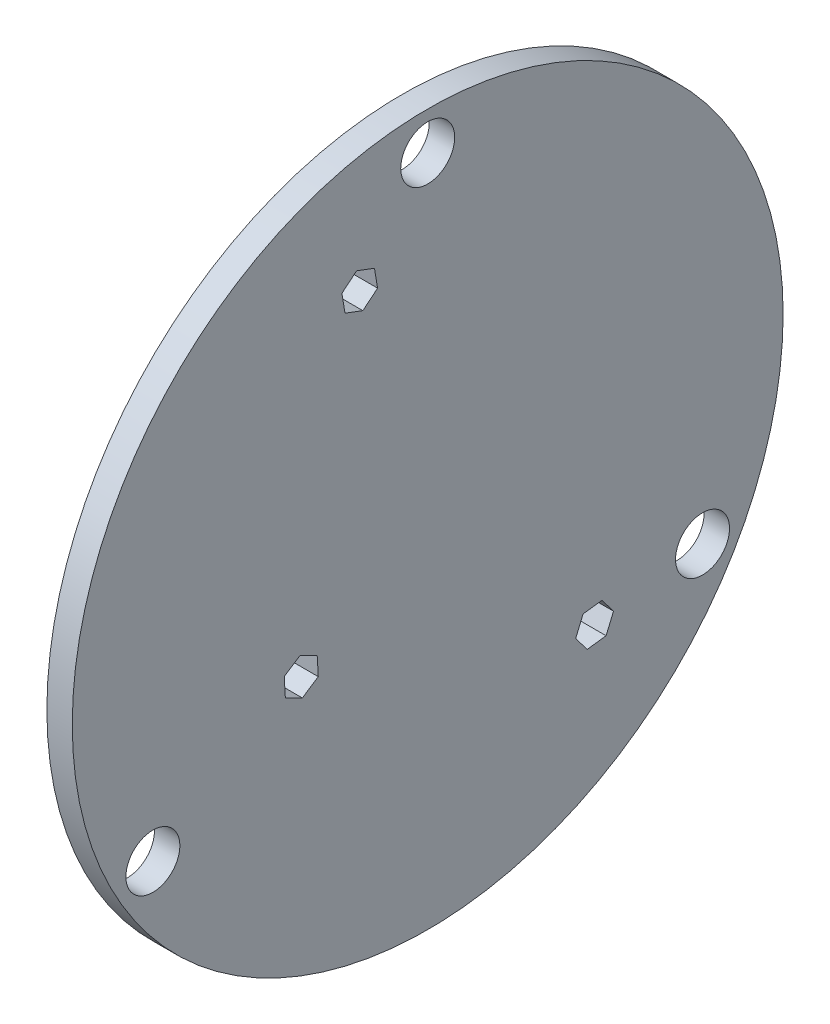
ISO-10303-21;
HEADER;
FILE_DESCRIPTION(('STEP AP214'),'2;1');
FILE_NAME('part.step','',(''),(''),'','','');
FILE_SCHEMA(('AUTOMOTIVE_DESIGN { 1 0 10303 214 1 1 1 1 }'));
ENDSEC;
DATA;
#1=APPLICATION_CONTEXT('core data for automotive mechanical design processes');
#2=APPLICATION_PROTOCOL_DEFINITION('international standard','automotive_design',2000,#1);
#3=PRODUCT_CONTEXT('',#1,'mechanical');
#4=PRODUCT('Part','Part','',(#3));
#5=PRODUCT_RELATED_PRODUCT_CATEGORY('part','',(#4));
#6=PRODUCT_DEFINITION_FORMATION('','',#4);
#7=PRODUCT_DEFINITION_CONTEXT('part definition',#1,'design');
#8=PRODUCT_DEFINITION('design','',#6,#7);
#9=PRODUCT_DEFINITION_SHAPE('','',#8);
#10=(LENGTH_UNIT() NAMED_UNIT(*) SI_UNIT(.MILLI.,.METRE.));
#11=(NAMED_UNIT(*) PLANE_ANGLE_UNIT() SI_UNIT($,.RADIAN.));
#12=(NAMED_UNIT(*) SI_UNIT($,.STERADIAN.) SOLID_ANGLE_UNIT());
#13=UNCERTAINTY_MEASURE_WITH_UNIT(LENGTH_MEASURE(1.E-05),#10,'distance_accuracy_value','');
#14=(GEOMETRIC_REPRESENTATION_CONTEXT(3) GLOBAL_UNCERTAINTY_ASSIGNED_CONTEXT((#13)) GLOBAL_UNIT_ASSIGNED_CONTEXT((#10,
#11,#12)) REPRESENTATION_CONTEXT('',''));
#15=CARTESIAN_POINT('',(0.,0.,0.));
#16=DIRECTION('',(0.,0.,1.));
#17=DIRECTION('',(1.,0.,0.));
#18=AXIS2_PLACEMENT_3D('',#15,#16,#17);
#19=CARTESIAN_POINT('',(4.,0.,0.));
#20=DIRECTION('',(-1.,0.,0.));
#21=DIRECTION('',(0.,0.,1.));
#22=AXIS2_PLACEMENT_3D('',#19,#20,#21);
#23=CYLINDRICAL_SURFACE('',#22,56.);
#24=CARTESIAN_POINT('',(4.,0.,0.));
#25=DIRECTION('',(1.,0.,0.));
#26=DIRECTION('',(0.,0.,-1.));
#27=AXIS2_PLACEMENT_3D('',#24,#25,#26);
#28=CIRCLE('',#27,56.);
#29=CARTESIAN_POINT('',(4.,0.,-56.));
#30=VERTEX_POINT('',#29);
#31=EDGE_CURVE('E11',#30,#30,#28,.T.);
#32=ORIENTED_EDGE('',*,*,#31,.F.);
#33=EDGE_LOOP('',(#32));
#34=FACE_BOUND('',#33,.T.);
#35=CARTESIAN_POINT('',(0.,0.,0.));
#36=DIRECTION('',(1.,0.,0.));
#37=DIRECTION('',(0.,0.,-1.));
#38=AXIS2_PLACEMENT_3D('',#35,#36,#37);
#39=CIRCLE('',#38,56.);
#40=CARTESIAN_POINT('',(0.,0.,-56.));
#41=VERTEX_POINT('',#40);
#42=EDGE_CURVE('E37',#41,#41,#39,.T.);
#43=ORIENTED_EDGE('',*,*,#42,.T.);
#44=EDGE_LOOP('',(#43));
#45=FACE_BOUND('',#44,.T.);
#46=ADVANCED_FACE('F34',(#34,#45),#23,.T.);
#47=CARTESIAN_POINT('',(4.,0.,0.));
#48=DIRECTION('',(1.,0.,0.));
#49=DIRECTION('',(0.,0.,-1.));
#50=AXIS2_PLACEMENT_3D('',#47,#48,#49);
#51=PLANE('',#50);
#52=DIRECTION('',(0.,-0.986414259171736,-0.164276928698694));
#53=VECTOR('',#52,1.);
#54=CARTESIAN_POINT('',(4.,37.596536924378,13.5170462951994));
#55=LINE('',#54,#53);
#56=CARTESIAN_POINT('',(4.,37.596536924378,13.5170462951994));
#57=VERTEX_POINT('',#56);
#58=CARTESIAN_POINT('',(4.,34.6351029264386,13.023850584369));
#59=VERTEX_POINT('',#58);
#60=EDGE_CURVE('E48',#57,#59,#55,.T.);
#61=ORIENTED_EDGE('',*,*,#60,.F.);
#62=DIRECTION('',(0.,-0.635475123094622,0.772121342748583));
#63=VECTOR('',#62,1.);
#64=CARTESIAN_POINT('',(4.,39.5043739379644,11.198967076768));
#65=LINE('',#64,#63);
#66=CARTESIAN_POINT('',(4.,39.5043739379644,11.198967076768));
#67=VERTEX_POINT('',#66);
#68=EDGE_CURVE('E180',#67,#57,#65,.T.);
#69=ORIENTED_EDGE('',*,*,#68,.F.);
#70=DIRECTION('',(0.,0.350939136077114,0.936398271447277));
#71=VECTOR('',#70,1.);
#72=CARTESIAN_POINT('',(4.,38.4507769536113,8.38769214750636));
#73=LINE('',#72,#71);
#74=CARTESIAN_POINT('',(4.,38.4507769536113,8.38769214750636));
#75=VERTEX_POINT('',#74);
#76=EDGE_CURVE('E183',#75,#67,#73,.T.);
#77=ORIENTED_EDGE('',*,*,#76,.F.);
#78=DIRECTION('',(0.,0.986414259171736,0.164276928698694));
#79=VECTOR('',#78,1.);
#80=CARTESIAN_POINT('',(4.,35.4893429556718,7.89449643667601));
#81=LINE('',#80,#79);
#82=CARTESIAN_POINT('',(4.,35.4893429556718,7.89449643667601));
#83=VERTEX_POINT('',#82);
#84=EDGE_CURVE('E200',#83,#75,#81,.T.);
#85=ORIENTED_EDGE('',*,*,#84,.F.);
#86=DIRECTION('',(0.,0.635475123094621,-0.772121342748584));
#87=VECTOR('',#86,1.);
#88=CARTESIAN_POINT('',(4.,33.5815059420854,10.2125756551073));
#89=LINE('',#88,#87);
#90=CARTESIAN_POINT('',(4.,33.5815059420854,10.2125756551073));
#91=VERTEX_POINT('',#90);
#92=EDGE_CURVE('E197',#91,#83,#89,.T.);
#93=ORIENTED_EDGE('',*,*,#92,.F.);
#94=DIRECTION('',(0.,-0.350939136077111,-0.936398271447278));
#95=VECTOR('',#94,1.);
#96=CARTESIAN_POINT('',(4.,34.6351029264386,13.023850584369));
#97=LINE('',#96,#95);
#98=EDGE_CURVE('E194',#59,#91,#97,.T.);
#99=ORIENTED_EDGE('',*,*,#98,.F.);
#100=EDGE_LOOP('',(#61,#69,#77,#85,#93,#99));
#101=FACE_BOUND('',#100,.T.);
#102=DIRECTION('',(0.,0.548968693626043,-0.835842911926946));
#103=VECTOR('',#102,1.);
#104=CARTESIAN_POINT('',(4.,-14.4972543509171,19.7459584221384));
#105=LINE('',#104,#103);
#106=CARTESIAN_POINT('',(4.,-14.4972543509171,19.7459584221384));
#107=VERTEX_POINT('',#106);
#108=CARTESIAN_POINT('',(4.,-12.8491287911004,17.2365729450918));
#109=VERTEX_POINT('',#108);
#110=EDGE_CURVE('E56',#107,#109,#105,.T.);
#111=ORIENTED_EDGE('',*,*,#110,.F.);
#112=DIRECTION('',(0.,-0.449376848488872,-0.893342290525983));
#113=VECTOR('',#112,1.);
#114=CARTESIAN_POINT('',(4.,-13.1481255598154,22.4279697640894));
#115=LINE('',#114,#113);
#116=CARTESIAN_POINT('',(4.,-13.1481255598154,22.4279697640894));
#117=VERTEX_POINT('',#116);
#118=EDGE_CURVE('E219',#117,#107,#115,.T.);
#119=ORIENTED_EDGE('',*,*,#118,.F.);
#120=DIRECTION('',(0.,-0.998345542114916,-0.0574993785990369));
#121=VECTOR('',#120,1.);
#122=CARTESIAN_POINT('',(4.,-10.150871208897,22.6005956289938));
#123=LINE('',#122,#121);
#124=CARTESIAN_POINT('',(4.,-10.150871208897,22.6005956289938));
#125=VERTEX_POINT('',#124);
#126=EDGE_CURVE('E245',#125,#117,#123,.T.);
#127=ORIENTED_EDGE('',*,*,#126,.F.);
#128=DIRECTION('',(0.,-0.548968693626043,0.835842911926945));
#129=VECTOR('',#128,1.);
#130=CARTESIAN_POINT('',(4.,-8.50274564908032,20.0912101519473));
#131=LINE('',#130,#129);
#132=CARTESIAN_POINT('',(4.,-8.50274564908032,20.0912101519473));
#133=VERTEX_POINT('',#132);
#134=EDGE_CURVE('E242',#133,#125,#131,.T.);
#135=ORIENTED_EDGE('',*,*,#134,.F.);
#136=DIRECTION('',(0.,0.449376848488873,0.893342290525982));
#137=VECTOR('',#136,1.);
#138=CARTESIAN_POINT('',(4.,-9.85187444018203,17.4091988099963));
#139=LINE('',#138,#137);
#140=CARTESIAN_POINT('',(4.,-9.85187444018203,17.4091988099963));
#141=VERTEX_POINT('',#140);
#142=EDGE_CURVE('E239',#141,#133,#139,.T.);
#143=ORIENTED_EDGE('',*,*,#142,.F.);
#144=DIRECTION('',(0.,0.998345542114916,0.0574993785990368));
#145=VECTOR('',#144,1.);
#146=CARTESIAN_POINT('',(4.,-12.8491287911004,17.2365729450918));
#147=LINE('',#146,#145);
#148=EDGE_CURVE('E236',#109,#141,#147,.T.);
#149=ORIENTED_EDGE('',*,*,#148,.F.);
#150=EDGE_LOOP('',(#111,#119,#127,#135,#143,#149));
#151=FACE_BOUND('',#150,.T.);
#152=DIRECTION('',(0.,0.796914909803171,0.60409157131465));
#153=VECTOR('',#152,1.);
#154=CARTESIAN_POINT('',(4.,-27.1685593526177,-29.2730157209621));
#155=LINE('',#154,#153);
#156=CARTESIAN_POINT('',(4.,-27.1685593526177,-29.2730157209621));
#157=VERTEX_POINT('',#156);
#158=CARTESIAN_POINT('',(4.,-24.776044356598,-27.4593990781309));
#159=VERTEX_POINT('',#158);
#160=EDGE_CURVE('E207',#157,#159,#155,.T.);
#161=ORIENTED_EDGE('',*,*,#160,.F.);
#162=DIRECTION('',(0.,0.921616101872132,-0.388102770886806));
#163=VECTOR('',#162,1.);
#164=CARTESIAN_POINT('',(4.,-29.9354549360456,-28.1078452768895));
#165=LINE('',#164,#163);
#166=CARTESIAN_POINT('',(4.,-29.9354549360456,-28.1078452768895));
#167=VERTEX_POINT('',#166);
#168=EDGE_CURVE('E264',#167,#157,#165,.T.);
#169=ORIENTED_EDGE('',*,*,#168,.F.);
#170=DIRECTION('',(0.,0.124701192068962,-0.992194342201456));
#171=VECTOR('',#170,1.);
#172=CARTESIAN_POINT('',(4.,-30.3098355234538,-25.1290581899856));
#173=LINE('',#172,#171);
#174=CARTESIAN_POINT('',(4.,-30.3098355234538,-25.1290581899856));
#175=VERTEX_POINT('',#174);
#176=EDGE_CURVE('E290',#175,#167,#173,.T.);
#177=ORIENTED_EDGE('',*,*,#176,.F.);
#178=DIRECTION('',(0.,-0.796914909803172,-0.60409157131465));
#179=VECTOR('',#178,1.);
#180=CARTESIAN_POINT('',(4.,-27.9173205274342,-23.3154415471544));
#181=LINE('',#180,#179);
#182=CARTESIAN_POINT('',(4.,-27.9173205274342,-23.3154415471544));
#183=VERTEX_POINT('',#182);
#184=EDGE_CURVE('E287',#183,#175,#181,.T.);
#185=ORIENTED_EDGE('',*,*,#184,.F.);
#186=DIRECTION('',(0.,-0.921616101872132,0.388102770886804));
#187=VECTOR('',#186,1.);
#188=CARTESIAN_POINT('',(4.,-25.1504249440063,-24.480611991227));
#189=LINE('',#188,#187);
#190=CARTESIAN_POINT('',(4.,-25.1504249440063,-24.480611991227));
#191=VERTEX_POINT('',#190);
#192=EDGE_CURVE('E284',#191,#183,#189,.T.);
#193=ORIENTED_EDGE('',*,*,#192,.F.);
#194=DIRECTION('',(0.,-0.124701192068961,0.992194342201456));
#195=VECTOR('',#194,1.);
#196=CARTESIAN_POINT('',(4.,-24.776044356598,-27.4593990781309));
#197=LINE('',#196,#195);
#198=EDGE_CURVE('E281',#159,#191,#197,.T.);
#199=ORIENTED_EDGE('',*,*,#198,.F.);
#200=EDGE_LOOP('',(#161,#169,#177,#185,#193,#199));
#201=FACE_BOUND('',#200,.T.);
#202=CARTESIAN_POINT('',(4.,-24.9999999999981,43.3012701892251));
#203=DIRECTION('',(-1.,0.,0.));
#204=DIRECTION('',(0.,0.,1.));
#205=AXIS2_PLACEMENT_3D('',#202,#203,#204);
#206=CIRCLE('',#205,4.25000000000278);
#207=CARTESIAN_POINT('',(4.,-24.9999999999981,47.5512701892279));
#208=VERTEX_POINT('',#207);
#209=EDGE_CURVE('E308',#208,#208,#206,.T.);
#210=ORIENTED_EDGE('',*,*,#209,.T.);
#211=EDGE_LOOP('',(#210));
#212=FACE_BOUND('',#211,.T.);
#213=CARTESIAN_POINT('',(4.,-25.0000000000019,-43.3012701892187));
#214=DIRECTION('',(-1.,0.,0.));
#215=DIRECTION('',(0.,0.,1.));
#216=AXIS2_PLACEMENT_3D('',#213,#214,#215);
#217=CIRCLE('',#216,4.25000000000406);
#218=CARTESIAN_POINT('',(4.,-25.0000000000019,-39.0512701892147));
#219=VERTEX_POINT('',#218);
#220=EDGE_CURVE('E315',#219,#219,#217,.T.);
#221=ORIENTED_EDGE('',*,*,#220,.T.);
#222=EDGE_LOOP('',(#221));
#223=FACE_BOUND('',#222,.T.);
#224=CARTESIAN_POINT('',(4.,50.,0.));
#225=DIRECTION('',(-1.,0.,0.));
#226=DIRECTION('',(0.,0.,1.));
#227=AXIS2_PLACEMENT_3D('',#224,#225,#226);
#228=CIRCLE('',#227,4.25);
#229=CARTESIAN_POINT('',(4.,50.,4.25));
#230=VERTEX_POINT('',#229);
#231=EDGE_CURVE('E320',#230,#230,#228,.T.);
#232=ORIENTED_EDGE('',*,*,#231,.T.);
#233=EDGE_LOOP('',(#232));
#234=FACE_BOUND('',#233,.T.);
#235=ORIENTED_EDGE('',*,*,#31,.T.);
#236=EDGE_LOOP('',(#235));
#237=FACE_BOUND('',#236,.T.);
#238=ADVANCED_FACE('F330',(#101,#151,#201,#212,#223,#234,#237),#51,.T.);
#239=CARTESIAN_POINT('',(0.,0.,0.));
#240=DIRECTION('',(1.,0.,0.));
#241=DIRECTION('',(0.,0.,-1.));
#242=AXIS2_PLACEMENT_3D('',#239,#240,#241);
#243=PLANE('',#242);
#244=DIRECTION('',(0.,-0.635475123094622,0.772121342748583));
#245=VECTOR('',#244,1.);
#246=CARTESIAN_POINT('',(0.,39.5043739379644,11.198967076768));
#247=LINE('',#246,#245);
#248=CARTESIAN_POINT('',(0.,39.5043739379644,11.198967076768));
#249=VERTEX_POINT('',#248);
#250=CARTESIAN_POINT('',(0.,37.596536924378,13.5170462951994));
#251=VERTEX_POINT('',#250);
#252=EDGE_CURVE('E166',#249,#251,#247,.T.);
#253=ORIENTED_EDGE('',*,*,#252,.T.);
#254=DIRECTION('',(0.,-0.986414259171736,-0.164276928698694));
#255=VECTOR('',#254,1.);
#256=CARTESIAN_POINT('',(0.,37.596536924378,13.5170462951994));
#257=LINE('',#256,#255);
#258=CARTESIAN_POINT('',(0.,34.6351029264386,13.023850584369));
#259=VERTEX_POINT('',#258);
#260=EDGE_CURVE('E160',#251,#259,#257,.T.);
#261=ORIENTED_EDGE('',*,*,#260,.T.);
#262=DIRECTION('',(0.,-0.350939136077111,-0.936398271447278));
#263=VECTOR('',#262,1.);
#264=CARTESIAN_POINT('',(0.,34.6351029264386,13.023850584369));
#265=LINE('',#264,#263);
#266=CARTESIAN_POINT('',(0.,33.5815059420854,10.2125756551073));
#267=VERTEX_POINT('',#266);
#268=EDGE_CURVE('E170',#259,#267,#265,.T.);
#269=ORIENTED_EDGE('',*,*,#268,.T.);
#270=DIRECTION('',(0.,0.635475123094621,-0.772121342748584));
#271=VECTOR('',#270,1.);
#272=CARTESIAN_POINT('',(0.,33.5815059420854,10.2125756551073));
#273=LINE('',#272,#271);
#274=CARTESIAN_POINT('',(0.,35.4893429556718,7.89449643667601));
#275=VERTEX_POINT('',#274);
#276=EDGE_CURVE('E174',#267,#275,#273,.T.);
#277=ORIENTED_EDGE('',*,*,#276,.T.);
#278=DIRECTION('',(0.,0.986414259171736,0.164276928698694));
#279=VECTOR('',#278,1.);
#280=CARTESIAN_POINT('',(0.,35.4893429556718,7.89449643667601));
#281=LINE('',#280,#279);
#282=CARTESIAN_POINT('',(0.,38.4507769536113,8.38769214750636));
#283=VERTEX_POINT('',#282);
#284=EDGE_CURVE('E187',#275,#283,#281,.T.);
#285=ORIENTED_EDGE('',*,*,#284,.T.);
#286=DIRECTION('',(0.,0.350939136077114,0.936398271447277));
#287=VECTOR('',#286,1.);
#288=CARTESIAN_POINT('',(0.,38.4507769536113,8.38769214750636));
#289=LINE('',#288,#287);
#290=EDGE_CURVE('E190',#283,#249,#289,.T.);
#291=ORIENTED_EDGE('',*,*,#290,.T.);
#292=EDGE_LOOP('',(#253,#261,#269,#277,#285,#291));
#293=FACE_BOUND('',#292,.T.);
#294=DIRECTION('',(0.,-0.449376848488872,-0.893342290525983));
#295=VECTOR('',#294,1.);
#296=CARTESIAN_POINT('',(0.,-13.1481255598154,22.4279697640894));
#297=LINE('',#296,#295);
#298=CARTESIAN_POINT('',(0.,-13.1481255598154,22.4279697640894));
#299=VERTEX_POINT('',#298);
#300=CARTESIAN_POINT('',(0.,-14.4972543509171,19.7459584221384));
#301=VERTEX_POINT('',#300);
#302=EDGE_CURVE('E231',#299,#301,#297,.T.);
#303=ORIENTED_EDGE('',*,*,#302,.T.);
#304=DIRECTION('',(0.,0.548968693626043,-0.835842911926946));
#305=VECTOR('',#304,1.);
#306=CARTESIAN_POINT('',(0.,-14.4972543509171,19.7459584221384));
#307=LINE('',#306,#305);
#308=CARTESIAN_POINT('',(0.,-12.8491287911004,17.2365729450918));
#309=VERTEX_POINT('',#308);
#310=EDGE_CURVE('E215',#301,#309,#307,.T.);
#311=ORIENTED_EDGE('',*,*,#310,.T.);
#312=DIRECTION('',(0.,0.998345542114916,0.0574993785990368));
#313=VECTOR('',#312,1.);
#314=CARTESIAN_POINT('',(0.,-12.8491287911004,17.2365729450918));
#315=LINE('',#314,#313);
#316=CARTESIAN_POINT('',(0.,-9.85187444018203,17.4091988099963));
#317=VERTEX_POINT('',#316);
#318=EDGE_CURVE('E218',#309,#317,#315,.T.);
#319=ORIENTED_EDGE('',*,*,#318,.T.);
#320=DIRECTION('',(0.,0.449376848488873,0.893342290525982));
#321=VECTOR('',#320,1.);
#322=CARTESIAN_POINT('',(0.,-9.85187444018203,17.4091988099963));
#323=LINE('',#322,#321);
#324=CARTESIAN_POINT('',(0.,-8.50274564908032,20.0912101519473));
#325=VERTEX_POINT('',#324);
#326=EDGE_CURVE('E222',#317,#325,#323,.T.);
#327=ORIENTED_EDGE('',*,*,#326,.T.);
#328=DIRECTION('',(0.,-0.548968693626043,0.835842911926945));
#329=VECTOR('',#328,1.);
#330=CARTESIAN_POINT('',(0.,-8.50274564908032,20.0912101519473));
#331=LINE('',#330,#329);
#332=CARTESIAN_POINT('',(0.,-10.150871208897,22.6005956289938));
#333=VERTEX_POINT('',#332);
#334=EDGE_CURVE('E225',#325,#333,#331,.T.);
#335=ORIENTED_EDGE('',*,*,#334,.T.);
#336=DIRECTION('',(0.,-0.998345542114916,-0.0574993785990369));
#337=VECTOR('',#336,1.);
#338=CARTESIAN_POINT('',(0.,-10.150871208897,22.6005956289938));
#339=LINE('',#338,#337);
#340=EDGE_CURVE('E228',#333,#299,#339,.T.);
#341=ORIENTED_EDGE('',*,*,#340,.T.);
#342=EDGE_LOOP('',(#303,#311,#319,#327,#335,#341));
#343=FACE_BOUND('',#342,.T.);
#344=DIRECTION('',(0.,0.921616101872132,-0.388102770886806));
#345=VECTOR('',#344,1.);
#346=CARTESIAN_POINT('',(0.,-29.9354549360456,-28.1078452768895));
#347=LINE('',#346,#345);
#348=CARTESIAN_POINT('',(0.,-29.9354549360456,-28.1078452768895));
#349=VERTEX_POINT('',#348);
#350=CARTESIAN_POINT('',(0.,-27.1685593526177,-29.2730157209621));
#351=VERTEX_POINT('',#350);
#352=EDGE_CURVE('E276',#349,#351,#347,.T.);
#353=ORIENTED_EDGE('',*,*,#352,.T.);
#354=DIRECTION('',(0.,0.796914909803171,0.60409157131465));
#355=VECTOR('',#354,1.);
#356=CARTESIAN_POINT('',(0.,-27.1685593526177,-29.2730157209621));
#357=LINE('',#356,#355);
#358=CARTESIAN_POINT('',(0.,-24.776044356598,-27.4593990781309));
#359=VERTEX_POINT('',#358);
#360=EDGE_CURVE('E260',#351,#359,#357,.T.);
#361=ORIENTED_EDGE('',*,*,#360,.T.);
#362=DIRECTION('',(0.,-0.124701192068961,0.992194342201456));
#363=VECTOR('',#362,1.);
#364=CARTESIAN_POINT('',(0.,-24.776044356598,-27.4593990781309));
#365=LINE('',#364,#363);
#366=CARTESIAN_POINT('',(0.,-25.1504249440063,-24.480611991227));
#367=VERTEX_POINT('',#366);
#368=EDGE_CURVE('E263',#359,#367,#365,.T.);
#369=ORIENTED_EDGE('',*,*,#368,.T.);
#370=DIRECTION('',(0.,-0.921616101872132,0.388102770886804));
#371=VECTOR('',#370,1.);
#372=CARTESIAN_POINT('',(0.,-25.1504249440063,-24.480611991227));
#373=LINE('',#372,#371);
#374=CARTESIAN_POINT('',(0.,-27.9173205274342,-23.3154415471544));
#375=VERTEX_POINT('',#374);
#376=EDGE_CURVE('E267',#367,#375,#373,.T.);
#377=ORIENTED_EDGE('',*,*,#376,.T.);
#378=DIRECTION('',(0.,-0.796914909803172,-0.60409157131465));
#379=VECTOR('',#378,1.);
#380=CARTESIAN_POINT('',(0.,-27.9173205274342,-23.3154415471544));
#381=LINE('',#380,#379);
#382=CARTESIAN_POINT('',(0.,-30.3098355234538,-25.1290581899856));
#383=VERTEX_POINT('',#382);
#384=EDGE_CURVE('E270',#375,#383,#381,.T.);
#385=ORIENTED_EDGE('',*,*,#384,.T.);
#386=DIRECTION('',(0.,0.124701192068962,-0.992194342201456));
#387=VECTOR('',#386,1.);
#388=CARTESIAN_POINT('',(0.,-30.3098355234538,-25.1290581899856));
#389=LINE('',#388,#387);
#390=EDGE_CURVE('E273',#383,#349,#389,.T.);
#391=ORIENTED_EDGE('',*,*,#390,.T.);
#392=EDGE_LOOP('',(#353,#361,#369,#377,#385,#391));
#393=FACE_BOUND('',#392,.T.);
#394=CARTESIAN_POINT('',(0.,-24.9999999999981,43.3012701892251));
#395=DIRECTION('',(-1.,0.,0.));
#396=DIRECTION('',(0.,0.,1.));
#397=AXIS2_PLACEMENT_3D('',#394,#395,#396);
#398=CIRCLE('',#397,4.25000000000278);
#399=CARTESIAN_POINT('',(0.,-24.9999999999981,47.5512701892279));
#400=VERTEX_POINT('',#399);
#401=EDGE_CURVE('E312',#400,#400,#398,.T.);
#402=ORIENTED_EDGE('',*,*,#401,.F.);
#403=EDGE_LOOP('',(#402));
#404=FACE_BOUND('',#403,.T.);
#405=CARTESIAN_POINT('',(0.,-25.0000000000019,-43.3012701892187));
#406=DIRECTION('',(-1.,0.,0.));
#407=DIRECTION('',(0.,0.,1.));
#408=AXIS2_PLACEMENT_3D('',#405,#406,#407);
#409=CIRCLE('',#408,4.25000000000406);
#410=CARTESIAN_POINT('',(0.,-25.0000000000019,-39.0512701892147));
#411=VERTEX_POINT('',#410);
#412=EDGE_CURVE('E297',#411,#411,#409,.T.);
#413=ORIENTED_EDGE('',*,*,#412,.F.);
#414=EDGE_LOOP('',(#413));
#415=FACE_BOUND('',#414,.T.);
#416=CARTESIAN_POINT('',(0.,50.,0.));
#417=DIRECTION('',(-1.,0.,0.));
#418=DIRECTION('',(0.,0.,1.));
#419=AXIS2_PLACEMENT_3D('',#416,#417,#418);
#420=CIRCLE('',#419,4.25);
#421=CARTESIAN_POINT('',(0.,50.,4.25));
#422=VERTEX_POINT('',#421);
#423=EDGE_CURVE('E311',#422,#422,#420,.T.);
#424=ORIENTED_EDGE('',*,*,#423,.F.);
#425=EDGE_LOOP('',(#424));
#426=FACE_BOUND('',#425,.T.);
#427=ORIENTED_EDGE('',*,*,#42,.F.);
#428=EDGE_LOOP('',(#427));
#429=FACE_BOUND('',#428,.T.);
#430=ADVANCED_FACE('F176',(#293,#343,#393,#404,#415,#426,#429),#243,.F.);
#431=CARTESIAN_POINT('',(4.,50.,0.));
#432=DIRECTION('',(-1.,0.,0.));
#433=DIRECTION('',(0.,0.,1.));
#434=AXIS2_PLACEMENT_3D('',#431,#432,#433);
#435=CYLINDRICAL_SURFACE('',#434,4.25);
#436=ORIENTED_EDGE('',*,*,#231,.F.);
#437=EDGE_LOOP('',(#436));
#438=FACE_BOUND('',#437,.T.);
#439=ORIENTED_EDGE('',*,*,#423,.T.);
#440=EDGE_LOOP('',(#439));
#441=FACE_BOUND('',#440,.T.);
#442=ADVANCED_FACE('F326',(#438,#441),#435,.F.);
#443=CARTESIAN_POINT('',(4.,-25.0000000000019,-43.3012701892187));
#444=DIRECTION('',(-1.,0.,0.));
#445=DIRECTION('',(0.,0.,1.));
#446=AXIS2_PLACEMENT_3D('',#443,#444,#445);
#447=CYLINDRICAL_SURFACE('',#446,4.25000000000406);
#448=ORIENTED_EDGE('',*,*,#220,.F.);
#449=EDGE_LOOP('',(#448));
#450=FACE_BOUND('',#449,.T.);
#451=ORIENTED_EDGE('',*,*,#412,.T.);
#452=EDGE_LOOP('',(#451));
#453=FACE_BOUND('',#452,.T.);
#454=ADVANCED_FACE('F349',(#450,#453),#447,.F.);
#455=CARTESIAN_POINT('',(4.,-24.9999999999981,43.3012701892251));
#456=DIRECTION('',(-1.,0.,0.));
#457=DIRECTION('',(0.,0.,1.));
#458=AXIS2_PLACEMENT_3D('',#455,#456,#457);
#459=CYLINDRICAL_SURFACE('',#458,4.25000000000278);
#460=ORIENTED_EDGE('',*,*,#209,.F.);
#461=EDGE_LOOP('',(#460));
#462=FACE_BOUND('',#461,.T.);
#463=ORIENTED_EDGE('',*,*,#401,.T.);
#464=EDGE_LOOP('',(#463));
#465=FACE_BOUND('',#464,.T.);
#466=ADVANCED_FACE('F353',(#462,#465),#459,.F.);
#467=CARTESIAN_POINT('',(0.,-27.1685593526177,-29.2730157209621));
#468=DIRECTION('',(0.,0.60409157131465,-0.796914909803171));
#469=DIRECTION('',(0.,0.796914909803171,0.60409157131465));
#470=AXIS2_PLACEMENT_3D('',#467,#468,#469);
#471=PLANE('',#470);
#472=ORIENTED_EDGE('',*,*,#160,.T.);
#473=DIRECTION('',(1.,0.,0.));
#474=VECTOR('',#473,1.);
#475=CARTESIAN_POINT('',(0.,-24.776044356598,-27.4593990781309));
#476=LINE('',#475,#474);
#477=EDGE_CURVE('E279',#359,#159,#476,.T.);
#478=ORIENTED_EDGE('',*,*,#477,.F.);
#479=ORIENTED_EDGE('',*,*,#360,.F.);
#480=DIRECTION('',(1.,0.,0.));
#481=VECTOR('',#480,1.);
#482=CARTESIAN_POINT('',(0.,-27.1685593526177,-29.2730157209621));
#483=LINE('',#482,#481);
#484=EDGE_CURVE('E295',#351,#157,#483,.T.);
#485=ORIENTED_EDGE('',*,*,#484,.T.);
#486=EDGE_LOOP('',(#472,#478,#479,#485));
#487=FACE_BOUND('',#486,.T.);
#488=ADVANCED_FACE('F357',(#487),#471,.F.);
#489=CARTESIAN_POINT('',(0.,-29.9354549360456,-28.1078452768895));
#490=DIRECTION('',(0.,-0.388102770886806,-0.921616101872132));
#491=DIRECTION('',(0.,0.921616101872132,-0.388102770886806));
#492=AXIS2_PLACEMENT_3D('',#489,#490,#491);
#493=PLANE('',#492);
#494=ORIENTED_EDGE('',*,*,#168,.T.);
#495=ORIENTED_EDGE('',*,*,#484,.F.);
#496=ORIENTED_EDGE('',*,*,#352,.F.);
#497=DIRECTION('',(1.,0.,0.));
#498=VECTOR('',#497,1.);
#499=CARTESIAN_POINT('',(0.,-29.9354549360456,-28.1078452768895));
#500=LINE('',#499,#498);
#501=EDGE_CURVE('E298',#349,#167,#500,.T.);
#502=ORIENTED_EDGE('',*,*,#501,.T.);
#503=EDGE_LOOP('',(#494,#495,#496,#502));
#504=FACE_BOUND('',#503,.T.);
#505=ADVANCED_FACE('F361',(#504),#493,.F.);
#506=CARTESIAN_POINT('',(0.,-30.3098355234538,-25.1290581899856));
#507=DIRECTION('',(0.,-0.992194342201456,-0.124701192068962));
#508=DIRECTION('',(0.,0.124701192068962,-0.992194342201456));
#509=AXIS2_PLACEMENT_3D('',#506,#507,#508);
#510=PLANE('',#509);
#511=ORIENTED_EDGE('',*,*,#176,.T.);
#512=ORIENTED_EDGE('',*,*,#501,.F.);
#513=ORIENTED_EDGE('',*,*,#390,.F.);
#514=DIRECTION('',(1.,0.,0.));
#515=VECTOR('',#514,1.);
#516=CARTESIAN_POINT('',(0.,-30.3098355234538,-25.1290581899856));
#517=LINE('',#516,#515);
#518=EDGE_CURVE('E300',#383,#175,#517,.T.);
#519=ORIENTED_EDGE('',*,*,#518,.T.);
#520=EDGE_LOOP('',(#511,#512,#513,#519));
#521=FACE_BOUND('',#520,.T.);
#522=ADVANCED_FACE('F375',(#521),#510,.F.);
#523=CARTESIAN_POINT('',(0.,-27.9173205274342,-23.3154415471544));
#524=DIRECTION('',(0.,-0.60409157131465,0.796914909803172));
#525=DIRECTION('',(0.,-0.796914909803172,-0.60409157131465));
#526=AXIS2_PLACEMENT_3D('',#523,#524,#525);
#527=PLANE('',#526);
#528=ORIENTED_EDGE('',*,*,#184,.T.);
#529=ORIENTED_EDGE('',*,*,#518,.F.);
#530=ORIENTED_EDGE('',*,*,#384,.F.);
#531=DIRECTION('',(1.,0.,0.));
#532=VECTOR('',#531,1.);
#533=CARTESIAN_POINT('',(0.,-27.9173205274342,-23.3154415471544));
#534=LINE('',#533,#532);
#535=EDGE_CURVE('E302',#375,#183,#534,.T.);
#536=ORIENTED_EDGE('',*,*,#535,.T.);
#537=EDGE_LOOP('',(#528,#529,#530,#536));
#538=FACE_BOUND('',#537,.T.);
#539=ADVANCED_FACE('F371',(#538),#527,.F.);
#540=CARTESIAN_POINT('',(0.,-25.1504249440063,-24.480611991227));
#541=DIRECTION('',(0.,0.388102770886805,0.921616101872132));
#542=DIRECTION('',(0.,-0.921616101872132,0.388102770886805));
#543=AXIS2_PLACEMENT_3D('',#540,#541,#542);
#544=PLANE('',#543);
#545=ORIENTED_EDGE('',*,*,#192,.T.);
#546=ORIENTED_EDGE('',*,*,#535,.F.);
#547=ORIENTED_EDGE('',*,*,#376,.F.);
#548=DIRECTION('',(1.,0.,0.));
#549=VECTOR('',#548,1.);
#550=CARTESIAN_POINT('',(0.,-25.1504249440063,-24.480611991227));
#551=LINE('',#550,#549);
#552=EDGE_CURVE('E304',#367,#191,#551,.T.);
#553=ORIENTED_EDGE('',*,*,#552,.T.);
#554=EDGE_LOOP('',(#545,#546,#547,#553));
#555=FACE_BOUND('',#554,.T.);
#556=ADVANCED_FACE('F367',(#555),#544,.F.);
#557=CARTESIAN_POINT('',(0.,-24.776044356598,-27.4593990781309));
#558=DIRECTION('',(0.,0.992194342201456,0.124701192068961));
#559=DIRECTION('',(0.,-0.124701192068961,0.992194342201456));
#560=AXIS2_PLACEMENT_3D('',#557,#558,#559);
#561=PLANE('',#560);
#562=ORIENTED_EDGE('',*,*,#198,.T.);
#563=ORIENTED_EDGE('',*,*,#552,.F.);
#564=ORIENTED_EDGE('',*,*,#368,.F.);
#565=ORIENTED_EDGE('',*,*,#477,.T.);
#566=EDGE_LOOP('',(#562,#563,#564,#565));
#567=FACE_BOUND('',#566,.T.);
#568=ADVANCED_FACE('F363',(#567),#561,.F.);
#569=CARTESIAN_POINT('',(0.,-14.4972543509171,19.7459584221384));
#570=DIRECTION('',(0.,-0.835842911926946,-0.548968693626043));
#571=DIRECTION('',(0.,0.548968693626043,-0.835842911926946));
#572=AXIS2_PLACEMENT_3D('',#569,#570,#571);
#573=PLANE('',#572);
#574=ORIENTED_EDGE('',*,*,#110,.T.);
#575=DIRECTION('',(1.,0.,0.));
#576=VECTOR('',#575,1.);
#577=CARTESIAN_POINT('',(0.,-12.8491287911004,17.2365729450918));
#578=LINE('',#577,#576);
#579=EDGE_CURVE('E234',#309,#109,#578,.T.);
#580=ORIENTED_EDGE('',*,*,#579,.F.);
#581=ORIENTED_EDGE('',*,*,#310,.F.);
#582=DIRECTION('',(1.,0.,0.));
#583=VECTOR('',#582,1.);
#584=CARTESIAN_POINT('',(0.,-14.4972543509171,19.7459584221384));
#585=LINE('',#584,#583);
#586=EDGE_CURVE('E195',#301,#107,#585,.T.);
#587=ORIENTED_EDGE('',*,*,#586,.T.);
#588=EDGE_LOOP('',(#574,#580,#581,#587));
#589=FACE_BOUND('',#588,.T.);
#590=ADVANCED_FACE('F366',(#589),#573,.F.);
#591=CARTESIAN_POINT('',(0.,-13.1481255598154,22.4279697640894));
#592=DIRECTION('',(0.,-0.893342290525983,0.449376848488872));
#593=DIRECTION('',(0.,-0.449376848488872,-0.893342290525983));
#594=AXIS2_PLACEMENT_3D('',#591,#592,#593);
#595=PLANE('',#594);
#596=ORIENTED_EDGE('',*,*,#118,.T.);
#597=ORIENTED_EDGE('',*,*,#586,.F.);
#598=ORIENTED_EDGE('',*,*,#302,.F.);
#599=DIRECTION('',(1.,0.,0.));
#600=VECTOR('',#599,1.);
#601=CARTESIAN_POINT('',(0.,-13.1481255598154,22.4279697640894));
#602=LINE('',#601,#600);
#603=EDGE_CURVE('E251',#299,#117,#602,.T.);
#604=ORIENTED_EDGE('',*,*,#603,.T.);
#605=EDGE_LOOP('',(#596,#597,#598,#604));
#606=FACE_BOUND('',#605,.T.);
#607=ADVANCED_FACE('F385',(#606),#595,.F.);
#608=CARTESIAN_POINT('',(0.,-10.150871208897,22.6005956289938));
#609=DIRECTION('',(0.,-0.0574993785990369,0.998345542114916));
#610=DIRECTION('',(0.,-0.998345542114916,-0.0574993785990369));
#611=AXIS2_PLACEMENT_3D('',#608,#609,#610);
#612=PLANE('',#611);
#613=ORIENTED_EDGE('',*,*,#126,.T.);
#614=ORIENTED_EDGE('',*,*,#603,.F.);
#615=ORIENTED_EDGE('',*,*,#340,.F.);
#616=DIRECTION('',(1.,0.,0.));
#617=VECTOR('',#616,1.);
#618=CARTESIAN_POINT('',(0.,-10.150871208897,22.6005956289938));
#619=LINE('',#618,#617);
#620=EDGE_CURVE('E253',#333,#125,#619,.T.);
#621=ORIENTED_EDGE('',*,*,#620,.T.);
#622=EDGE_LOOP('',(#613,#614,#615,#621));
#623=FACE_BOUND('',#622,.T.);
#624=ADVANCED_FACE('F397',(#623),#612,.F.);
#625=CARTESIAN_POINT('',(0.,-8.50274564908032,20.0912101519473));
#626=DIRECTION('',(0.,0.835842911926945,0.548968693626043));
#627=DIRECTION('',(0.,-0.548968693626043,0.835842911926945));
#628=AXIS2_PLACEMENT_3D('',#625,#626,#627);
#629=PLANE('',#628);
#630=ORIENTED_EDGE('',*,*,#134,.T.);
#631=ORIENTED_EDGE('',*,*,#620,.F.);
#632=ORIENTED_EDGE('',*,*,#334,.F.);
#633=DIRECTION('',(1.,0.,0.));
#634=VECTOR('',#633,1.);
#635=CARTESIAN_POINT('',(0.,-8.50274564908032,20.0912101519473));
#636=LINE('',#635,#634);
#637=EDGE_CURVE('E255',#325,#133,#636,.T.);
#638=ORIENTED_EDGE('',*,*,#637,.T.);
#639=EDGE_LOOP('',(#630,#631,#632,#638));
#640=FACE_BOUND('',#639,.T.);
#641=ADVANCED_FACE('F393',(#640),#629,.F.);
#642=CARTESIAN_POINT('',(0.,-9.85187444018203,17.4091988099963));
#643=DIRECTION('',(0.,0.893342290525982,-0.449376848488873));
#644=DIRECTION('',(0.,0.449376848488873,0.893342290525983));
#645=AXIS2_PLACEMENT_3D('',#642,#643,#644);
#646=PLANE('',#645);
#647=ORIENTED_EDGE('',*,*,#142,.T.);
#648=ORIENTED_EDGE('',*,*,#637,.F.);
#649=ORIENTED_EDGE('',*,*,#326,.F.);
#650=DIRECTION('',(1.,0.,0.));
#651=VECTOR('',#650,1.);
#652=CARTESIAN_POINT('',(0.,-9.85187444018203,17.4091988099963));
#653=LINE('',#652,#651);
#654=EDGE_CURVE('E257',#317,#141,#653,.T.);
#655=ORIENTED_EDGE('',*,*,#654,.T.);
#656=EDGE_LOOP('',(#647,#648,#649,#655));
#657=FACE_BOUND('',#656,.T.);
#658=ADVANCED_FACE('F389',(#657),#646,.F.);
#659=CARTESIAN_POINT('',(0.,-12.8491287911004,17.2365729450918));
#660=DIRECTION('',(0.,0.0574993785990368,-0.998345542114916));
#661=DIRECTION('',(0.,0.998345542114916,0.0574993785990368));
#662=AXIS2_PLACEMENT_3D('',#659,#660,#661);
#663=PLANE('',#662);
#664=ORIENTED_EDGE('',*,*,#148,.T.);
#665=ORIENTED_EDGE('',*,*,#654,.F.);
#666=ORIENTED_EDGE('',*,*,#318,.F.);
#667=ORIENTED_EDGE('',*,*,#579,.T.);
#668=EDGE_LOOP('',(#664,#665,#666,#667));
#669=FACE_BOUND('',#668,.T.);
#670=ADVANCED_FACE('F386',(#669),#663,.F.);
#671=CARTESIAN_POINT('',(0.,37.596536924378,13.5170462951994));
#672=DIRECTION('',(0.,-0.164276928698694,0.986414259171736));
#673=DIRECTION('',(0.,-0.986414259171736,-0.164276928698694));
#674=AXIS2_PLACEMENT_3D('',#671,#672,#673);
#675=PLANE('',#674);
#676=ORIENTED_EDGE('',*,*,#60,.T.);
#677=DIRECTION('',(1.,0.,0.));
#678=VECTOR('',#677,1.);
#679=CARTESIAN_POINT('',(0.,34.6351029264386,13.023850584369));
#680=LINE('',#679,#678);
#681=EDGE_CURVE('E156',#259,#59,#680,.T.);
#682=ORIENTED_EDGE('',*,*,#681,.F.);
#683=ORIENTED_EDGE('',*,*,#260,.F.);
#684=DIRECTION('',(1.,0.,0.));
#685=VECTOR('',#684,1.);
#686=CARTESIAN_POINT('',(0.,37.596536924378,13.5170462951994));
#687=LINE('',#686,#685);
#688=EDGE_CURVE('E205',#251,#57,#687,.T.);
#689=ORIENTED_EDGE('',*,*,#688,.T.);
#690=EDGE_LOOP('',(#676,#682,#683,#689));
#691=FACE_BOUND('',#690,.T.);
#692=ADVANCED_FACE('F158',(#691),#675,.F.);
#693=CARTESIAN_POINT('',(0.,39.5043739379644,11.198967076768));
#694=DIRECTION('',(0.,0.772121342748583,0.635475123094622));
#695=DIRECTION('',(0.,-0.635475123094622,0.772121342748583));
#696=AXIS2_PLACEMENT_3D('',#693,#694,#695);
#697=PLANE('',#696);
#698=ORIENTED_EDGE('',*,*,#68,.T.);
#699=ORIENTED_EDGE('',*,*,#688,.F.);
#700=ORIENTED_EDGE('',*,*,#252,.F.);
#701=DIRECTION('',(1.,0.,0.));
#702=VECTOR('',#701,1.);
#703=CARTESIAN_POINT('',(0.,39.5043739379644,11.198967076768));
#704=LINE('',#703,#702);
#705=EDGE_CURVE('E208',#249,#67,#704,.T.);
#706=ORIENTED_EDGE('',*,*,#705,.T.);
#707=EDGE_LOOP('',(#698,#699,#700,#706));
#708=FACE_BOUND('',#707,.T.);
#709=ADVANCED_FACE('F407',(#708),#697,.F.);
#710=CARTESIAN_POINT('',(0.,38.4507769536113,8.38769214750636));
#711=DIRECTION('',(0.,0.936398271447278,-0.350939136077114));
#712=DIRECTION('',(0.,0.350939136077114,0.936398271447277));
#713=AXIS2_PLACEMENT_3D('',#710,#711,#712);
#714=PLANE('',#713);
#715=ORIENTED_EDGE('',*,*,#76,.T.);
#716=ORIENTED_EDGE('',*,*,#705,.F.);
#717=ORIENTED_EDGE('',*,*,#290,.F.);
#718=DIRECTION('',(1.,0.,0.));
#719=VECTOR('',#718,1.);
#720=CARTESIAN_POINT('',(0.,38.4507769536113,8.38769214750636));
#721=LINE('',#720,#719);
#722=EDGE_CURVE('E210',#283,#75,#721,.T.);
#723=ORIENTED_EDGE('',*,*,#722,.T.);
#724=EDGE_LOOP('',(#715,#716,#717,#723));
#725=FACE_BOUND('',#724,.T.);
#726=ADVANCED_FACE('F417',(#725),#714,.F.);
#727=CARTESIAN_POINT('',(0.,35.4893429556718,7.89449643667601));
#728=DIRECTION('',(0.,0.164276928698694,-0.986414259171736));
#729=DIRECTION('',(0.,0.986414259171736,0.164276928698694));
#730=AXIS2_PLACEMENT_3D('',#727,#728,#729);
#731=PLANE('',#730);
#732=ORIENTED_EDGE('',*,*,#84,.T.);
#733=ORIENTED_EDGE('',*,*,#722,.F.);
#734=ORIENTED_EDGE('',*,*,#284,.F.);
#735=DIRECTION('',(1.,0.,0.));
#736=VECTOR('',#735,1.);
#737=CARTESIAN_POINT('',(0.,35.4893429556718,7.89449643667601));
#738=LINE('',#737,#736);
#739=EDGE_CURVE('E212',#275,#83,#738,.T.);
#740=ORIENTED_EDGE('',*,*,#739,.T.);
#741=EDGE_LOOP('',(#732,#733,#734,#740));
#742=FACE_BOUND('',#741,.T.);
#743=ADVANCED_FACE('F413',(#742),#731,.F.);
#744=CARTESIAN_POINT('',(0.,33.5815059420854,10.2125756551073));
#745=DIRECTION('',(0.,-0.772121342748584,-0.635475123094621));
#746=DIRECTION('',(0.,0.635475123094621,-0.772121342748584));
#747=AXIS2_PLACEMENT_3D('',#744,#745,#746);
#748=PLANE('',#747);
#749=ORIENTED_EDGE('',*,*,#92,.T.);
#750=ORIENTED_EDGE('',*,*,#739,.F.);
#751=ORIENTED_EDGE('',*,*,#276,.F.);
#752=DIRECTION('',(1.,0.,0.));
#753=VECTOR('',#752,1.);
#754=CARTESIAN_POINT('',(0.,33.5815059420854,10.2125756551073));
#755=LINE('',#754,#753);
#756=EDGE_CURVE('E165',#267,#91,#755,.T.);
#757=ORIENTED_EDGE('',*,*,#756,.T.);
#758=EDGE_LOOP('',(#749,#750,#751,#757));
#759=FACE_BOUND('',#758,.T.);
#760=ADVANCED_FACE('F410',(#759),#748,.F.);
#761=CARTESIAN_POINT('',(0.,34.6351029264386,13.023850584369));
#762=DIRECTION('',(0.,-0.936398271447278,0.350939136077111));
#763=DIRECTION('',(0.,-0.350939136077111,-0.936398271447278));
#764=AXIS2_PLACEMENT_3D('',#761,#762,#763);
#765=PLANE('',#764);
#766=ORIENTED_EDGE('',*,*,#98,.T.);
#767=ORIENTED_EDGE('',*,*,#756,.F.);
#768=ORIENTED_EDGE('',*,*,#268,.F.);
#769=ORIENTED_EDGE('',*,*,#681,.T.);
#770=EDGE_LOOP('',(#766,#767,#768,#769));
#771=FACE_BOUND('',#770,.T.);
#772=ADVANCED_FACE('F171',(#771),#765,.F.);
#773=CLOSED_SHELL('',(#46,#238,#430,#442,#454,#466,#488,#505,#522,#539,#556,#568,#590,#607,#624,
#641,#658,#670,#692,#709,#726,#743,#760,#772));
#774=MANIFOLD_SOLID_BREP('B2',#773);
#775=ADVANCED_BREP_SHAPE_REPRESENTATION('',(#18,#774),#14);
#776=SHAPE_DEFINITION_REPRESENTATION(#9,#775);
ENDSEC;
END-ISO-10303-21;
